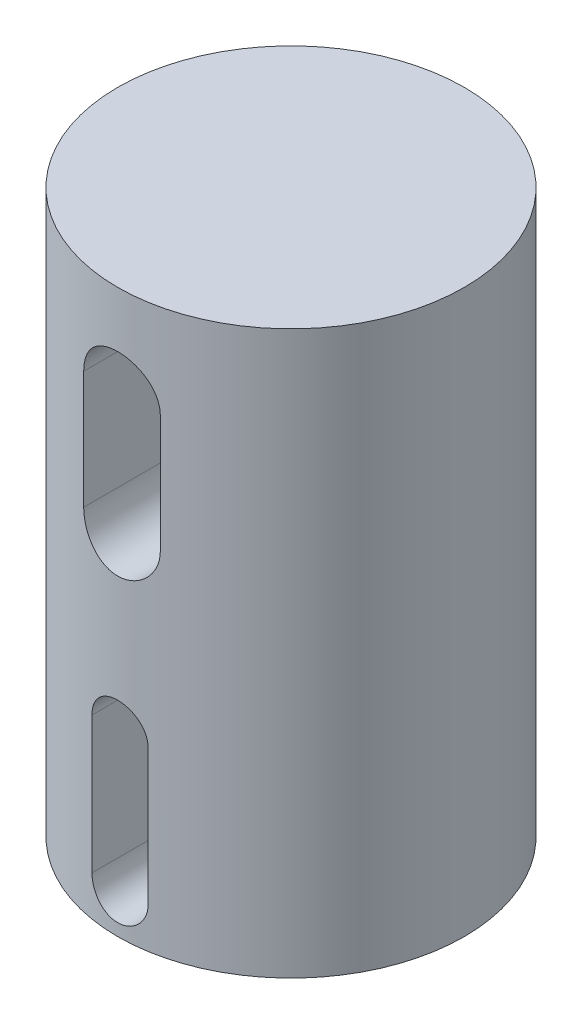
ISO-10303-21;
HEADER;
FILE_DESCRIPTION(('STEP AP214'),'2;1');
FILE_NAME('part.step','',(''),(''),'','','');
FILE_SCHEMA(('AUTOMOTIVE_DESIGN { 1 0 10303 214 1 1 1 1 }'));
ENDSEC;
DATA;
#1=APPLICATION_CONTEXT('core data for automotive mechanical design processes');
#2=APPLICATION_PROTOCOL_DEFINITION('international standard','automotive_design',2000,#1);
#3=PRODUCT_CONTEXT('',#1,'mechanical');
#4=PRODUCT('Part','Part','',(#3));
#5=PRODUCT_RELATED_PRODUCT_CATEGORY('part','',(#4));
#6=PRODUCT_DEFINITION_FORMATION('','',#4);
#7=PRODUCT_DEFINITION_CONTEXT('part definition',#1,'design');
#8=PRODUCT_DEFINITION('design','',#6,#7);
#9=PRODUCT_DEFINITION_SHAPE('','',#8);
#10=(LENGTH_UNIT() NAMED_UNIT(*) SI_UNIT(.MILLI.,.METRE.));
#11=(NAMED_UNIT(*) PLANE_ANGLE_UNIT() SI_UNIT($,.RADIAN.));
#12=(NAMED_UNIT(*) SI_UNIT($,.STERADIAN.) SOLID_ANGLE_UNIT());
#13=UNCERTAINTY_MEASURE_WITH_UNIT(LENGTH_MEASURE(1.E-05),#10,'distance_accuracy_value','');
#14=(GEOMETRIC_REPRESENTATION_CONTEXT(3) GLOBAL_UNCERTAINTY_ASSIGNED_CONTEXT((#13)) GLOBAL_UNIT_ASSIGNED_CONTEXT((#10,
#11,#12)) REPRESENTATION_CONTEXT('',''));
#15=CARTESIAN_POINT('',(0.,0.,0.));
#16=DIRECTION('',(0.,0.,1.));
#17=DIRECTION('',(1.,0.,0.));
#18=AXIS2_PLACEMENT_3D('',#15,#16,#17);
#19=CARTESIAN_POINT('',(0.,130.,0.));
#20=DIRECTION('',(0.,-1.,0.));
#21=DIRECTION('',(0.,0.,-1.));
#22=AXIS2_PLACEMENT_3D('',#19,#20,#21);
#23=CYLINDRICAL_SURFACE('',#22,40.0612109012705);
#24=DIRECTION('',(0.,-1.,0.));
#25=VECTOR('',#24,1.);
#26=CARTESIAN_POINT('',(8.85733849172649,130.,39.0697859441161));
#27=LINE('',#26,#25);
#28=CARTESIAN_POINT('',(8.85733849172649,108.295199343887,39.0697859441161));
#29=VERTEX_POINT('',#28);
#30=CARTESIAN_POINT('',(8.85733849172649,81.0621884588774,39.0697859441161));
#31=VERTEX_POINT('',#30);
#32=EDGE_CURVE('E11',#29,#31,#27,.T.);
#33=ORIENTED_EDGE('',*,*,#32,.T.);
#34=CARTESIAN_POINT('',(8.85733849172649,81.0621884588774,39.0697859441161));
#35=CARTESIAN_POINT('',(8.85736862514041,80.8163273564293,39.0697613117036));
#36=CARTESIAN_POINT('',(8.8471029394657,80.570474765995,39.0721058681542));
#37=CARTESIAN_POINT('',(8.80620076539065,80.0805899058059,39.0813543489662));
#38=CARTESIAN_POINT('',(8.77556715182994,79.8365573840715,39.0882576298836));
#39=CARTESIAN_POINT('',(8.69421905100763,79.3524574275804,39.1064291838135));
#40=CARTESIAN_POINT('',(8.64353879163294,79.1123839571394,39.1176900159823));
#41=CARTESIAN_POINT('',(8.52251401858338,78.6374745248508,39.144236272939));
#42=CARTESIAN_POINT('',(8.45216935052138,78.4026386041393,39.1595217293245));
#43=CARTESIAN_POINT('',(8.29237790071108,77.939877196313,39.1936697363761));
#44=CARTESIAN_POINT('',(8.20293455253129,77.7119504754593,39.2125316439981));
#45=CARTESIAN_POINT('',(8.00557698938492,77.2644243275569,39.2532993214893));
#46=CARTESIAN_POINT('',(7.89765595595808,77.0448280111871,39.2752062144264));
#47=CARTESIAN_POINT('',(7.66415547847754,76.615518808133,39.3214381184222));
#48=CARTESIAN_POINT('',(7.53857699329189,76.4058053855944,39.3457629981537));
#49=CARTESIAN_POINT('',(7.27063062813367,75.9976070607811,39.3961562389163));
#50=CARTESIAN_POINT('',(7.1282620859637,75.7991226018322,39.4222246686952));
#51=CARTESIAN_POINT('',(6.8253899404433,75.4117127380569,39.4757986010856));
#52=CARTESIAN_POINT('',(6.6646413277187,75.2229810384817,39.503320028846));
#53=CARTESIAN_POINT('',(6.32791991634466,74.8596712126249,39.558654572253));
#54=CARTESIAN_POINT('',(6.15194698484809,74.6850932098738,39.5864676904431));
#55=CARTESIAN_POINT('',(5.7859200594194,74.3512314821128,39.641619538426));
#56=CARTESIAN_POINT('',(5.59586368097199,74.1919503575985,39.6689581869131));
#57=CARTESIAN_POINT('',(5.20296270593714,73.8898082397179,39.7224004371487));
#58=CARTESIAN_POINT('',(5.00011844167541,73.7469468199161,39.7485040709613));
#59=CARTESIAN_POINT('',(4.58069376841164,73.4771675031501,39.7990321448431));
#60=CARTESIAN_POINT('',(4.3639869515153,73.3504419717588,39.8234349905894));
#61=CARTESIAN_POINT('',(3.9204568822295,73.1157814468343,39.8695412738507));
#62=CARTESIAN_POINT('',(3.6936375106396,73.0078393216289,39.8912457349891));
#63=CARTESIAN_POINT('',(3.23138641861698,72.8115130880777,39.9313483043602));
#64=CARTESIAN_POINT('',(2.99595423521563,72.7231300329055,39.9497462345402));
#65=CARTESIAN_POINT('',(2.51818423327674,72.5666379622019,39.9827049505392));
#66=CARTESIAN_POINT('',(2.2758465394607,72.4985285807586,39.9972658056115));
#67=CARTESIAN_POINT('',(1.78996244581745,72.3840678587402,40.0219299424861));
#68=CARTESIAN_POINT('',(1.54649727933049,72.3373861410857,40.0321007535435));
#69=CARTESIAN_POINT('',(1.05636901356677,72.2645803349115,40.0480313802494));
#70=CARTESIAN_POINT('',(0.809705944925126,72.2384560496044,40.0537912381221));
#71=CARTESIAN_POINT('',(0.315013192535823,72.2069846023485,40.060736048565));
#72=CARTESIAN_POINT('',(0.0669836186692188,72.2016357935686,40.0619213637502));
#73=CARTESIAN_POINT('',(-0.428628271217608,72.2117560083495,40.0596842657529));
#74=CARTESIAN_POINT('',(-0.676210591505028,72.2272248322297,40.0562618967667));
#75=CARTESIAN_POINT('',(-1.16476022921607,72.2783942976664,40.0450072598245));
#76=CARTESIAN_POINT('',(-1.40576727175716,72.3137339901392,40.037253683096));
#77=CARTESIAN_POINT('',(-1.88397712831053,72.4041107509349,40.0176028672444));
#78=CARTESIAN_POINT('',(-2.12117853512227,72.4591549375974,40.0057041307049));
#79=CARTESIAN_POINT('',(-2.589996422941,72.5884948011973,39.978089890599));
#80=CARTESIAN_POINT('',(-2.82161390191677,72.6627870097954,39.9623750746915));
#81=CARTESIAN_POINT('',(-3.27774084824535,72.8300640531267,39.9275513687475));
#82=CARTESIAN_POINT('',(-3.50225003541088,72.9230496236363,39.9084423451174));
#83=CARTESIAN_POINT('',(-3.94429569623805,73.1277856633075,39.8671894916423));
#84=CARTESIAN_POINT('',(-4.16176789465354,73.2396705471254,39.8450241483626));
#85=CARTESIAN_POINT('',(-4.58653338389336,73.4809079634874,39.798366664967));
#86=CARTESIAN_POINT('',(-4.79382662921221,73.6102605741121,39.7738745144506));
#87=CARTESIAN_POINT('',(-5.19690570679813,73.8855467615169,39.7232181556221));
#88=CARTESIAN_POINT('',(-5.39269041683415,74.0314819512565,39.6970537847645));
#89=CARTESIAN_POINT('',(-5.77146760611019,74.338937126415,39.6437557091327));
#90=CARTESIAN_POINT('',(-5.95446016158853,74.500457018939,39.6166220101369));
#91=CARTESIAN_POINT('',(-6.31023968793187,74.8416296014669,39.5615291922752));
#92=CARTESIAN_POINT('',(-6.48272533782995,75.0215958145242,39.5335648192083));
#93=CARTESIAN_POINT('',(-6.81190212408968,75.3954047411682,39.4781770686464));
#94=CARTESIAN_POINT('',(-6.96859847760323,75.5892428347169,39.450753514877));
#95=CARTESIAN_POINT('',(-7.26525016406895,75.9896453088489,39.397201616364));
#96=CARTESIAN_POINT('',(-7.40519763323719,76.1962155989171,39.3710738833675));
#97=CARTESIAN_POINT('',(-7.66726493923479,76.6206024213808,39.3208783576756));
#98=CARTESIAN_POINT('',(-7.78938534807829,76.8384185926277,39.2968104988957));
#99=CARTESIAN_POINT('',(-8.01531884974299,77.2846392659583,39.251351802762));
#100=CARTESIAN_POINT('',(-8.11906271017704,77.5130798804636,39.2299711736443));
#101=CARTESIAN_POINT('',(-8.30688156333853,77.9781880112174,39.1906309041491));
#102=CARTESIAN_POINT('',(-8.39095731382699,78.2148552101135,39.17267113198));
#103=CARTESIAN_POINT('',(-8.53867804366612,78.694425603372,39.1407371845776));
#104=CARTESIAN_POINT('',(-8.60234782025804,78.9373208386292,39.1267581742634));
#105=CARTESIAN_POINT('',(-8.70884436438421,79.4277468608429,39.1031919769596));
#106=CARTESIAN_POINT('',(-8.75168098316427,79.6752753992609,39.0936027143434));
#107=CARTESIAN_POINT('',(-8.80838219273812,80.1129413487383,39.0808605830131));
#108=CARTESIAN_POINT('',(-8.82674821907766,80.3024795605936,39.0767119347328));
#109=CARTESIAN_POINT('',(-8.85122033244665,80.6820690798181,39.0711728978441));
#110=CARTESIAN_POINT('',(-8.8573467474399,80.8721190106211,39.0697779358655));
#111=CARTESIAN_POINT('',(-8.85733849172649,81.0621884588774,39.0697859441161));
#112=B_SPLINE_CURVE_WITH_KNOTS('',3,(#34,#35,#36,#37,#38,#39,#40,#41,#42,#43,#44,#45,#46,#47,
#48,#49,#50,#51,#52,#53,#54,#55,#56,#57,#58,#59,#60,#61,#62,#63,#64,#65,#66,#67,#68,#69,#70,#71,
#72,#73,#74,#75,#76,#77,#78,#79,#80,#81,#82,#83,#84,#85,#86,#87,#88,#89,#90,#91,#92,#93,#94,#95,
#96,#97,#98,#99,#100,#101,#102,#103,#104,#105,#106,#107,#108,#109,#110,#111),.UNSPECIFIED.,.F.,
.F.,(4,2,2,2,2,2,2,2,2,2,2,2,2,2,2,2,2,2,2,2,2,2,2,2,2,2,2,2,2,2,2,2,2,2,2,2,2,2,4),(0.,
0.737345029552919,1.47458600832271,2.21057360911096,2.94656698836976,3.68242816167518,
4.41856146305015,5.15465480496202,5.89077718800321,6.63820875318835,7.38564684110572,
8.13321177068837,8.88075728089798,9.63651406356938,10.3919832718916,11.1474931491561,
11.9029893896768,12.6464098669833,13.3898232277618,14.1331776584243,14.8765249589618,
15.6067865752622,16.3373122686169,17.0677064185356,17.7981293226208,18.5339845096341,
19.2698429860225,20.0057730994984,20.7416988266247,21.4933373689583,22.2447267323057,
22.9964675085492,23.7481841584972,24.5026752528817,25.2571372739009,26.0106789691738,
26.7638639945813,27.3348797800297,27.9049464119767),.UNSPECIFIED.);
#113=CARTESIAN_POINT('',(-8.85733849172649,81.0621884588774,39.0697859441161));
#114=VERTEX_POINT('',#113);
#115=EDGE_CURVE('E242',#31,#114,#112,.T.);
#116=ORIENTED_EDGE('',*,*,#115,.T.);
#117=DIRECTION('',(0.,-1.,0.));
#118=VECTOR('',#117,1.);
#119=CARTESIAN_POINT('',(-8.85733849172649,130.,39.0697859441161));
#120=LINE('',#119,#118);
#121=CARTESIAN_POINT('',(-8.85733849172649,108.295199343887,39.0697859441161));
#122=VERTEX_POINT('',#121);
#123=EDGE_CURVE('E53',#114,#122,#120,.F.);
#124=ORIENTED_EDGE('',*,*,#123,.T.);
#125=CARTESIAN_POINT('',(-8.85733849172649,108.295199343887,39.0697859441161));
#126=CARTESIAN_POINT('',(-8.85736862514041,108.541060446335,39.0697613117036));
#127=CARTESIAN_POINT('',(-8.8471029394657,108.78691303677,39.0721058681542));
#128=CARTESIAN_POINT('',(-8.80620076539065,109.276797896959,39.0813543489662));
#129=CARTESIAN_POINT('',(-8.77556715182994,109.520830418693,39.0882576298836));
#130=CARTESIAN_POINT('',(-8.69421905100763,110.004930375184,39.1064291838135));
#131=CARTESIAN_POINT('',(-8.64353879163294,110.245003845625,39.1176900159823));
#132=CARTESIAN_POINT('',(-8.52251401858338,110.719913277914,39.144236272939));
#133=CARTESIAN_POINT('',(-8.45216935052138,110.954749198625,39.1595217293245));
#134=CARTESIAN_POINT('',(-8.29237790071108,111.417510606452,39.1936697363761));
#135=CARTESIAN_POINT('',(-8.20293455253129,111.645437327305,39.2125316439981));
#136=CARTESIAN_POINT('',(-8.00557698938491,112.092963475208,39.2532993214893));
#137=CARTESIAN_POINT('',(-7.89765595595808,112.312559791578,39.2752062144264));
#138=CARTESIAN_POINT('',(-7.66415547847755,112.741868994632,39.3214381184221));
#139=CARTESIAN_POINT('',(-7.53857699329191,112.95158241717,39.3457629981537));
#140=CARTESIAN_POINT('',(-7.27063062813369,113.359780741984,39.3961562389163));
#141=CARTESIAN_POINT('',(-7.12826208596371,113.558265200932,39.4222246686952));
#142=CARTESIAN_POINT('',(-6.8253899404433,113.945675064708,39.4757986010856));
#143=CARTESIAN_POINT('',(-6.6646413277187,114.134406764283,39.503320028846));
#144=CARTESIAN_POINT('',(-6.32791991634466,114.49771659014,39.558654572253));
#145=CARTESIAN_POINT('',(-6.15194698484809,114.672294592891,39.5864676904431));
#146=CARTESIAN_POINT('',(-5.7859200594194,115.006156320652,39.641619538426));
#147=CARTESIAN_POINT('',(-5.59586368097199,115.165437445166,39.6689581869131));
#148=CARTESIAN_POINT('',(-5.20296270593714,115.467579563047,39.7224004371487));
#149=CARTESIAN_POINT('',(-5.00011844167541,115.610440982849,39.7485040709613));
#150=CARTESIAN_POINT('',(-4.58069376841164,115.880220299615,39.7990321448431));
#151=CARTESIAN_POINT('',(-4.3639869515153,116.006945831006,39.8234349905894));
#152=CARTESIAN_POINT('',(-3.9204568822295,116.24160635593,39.8695412738507));
#153=CARTESIAN_POINT('',(-3.6936375106396,116.349548481136,39.8912457349891));
#154=CARTESIAN_POINT('',(-3.23138641861698,116.545874714687,39.9313483043602));
#155=CARTESIAN_POINT('',(-2.99595423521563,116.634257769859,39.9497462345402));
#156=CARTESIAN_POINT('',(-2.51818423327674,116.790749840563,39.9827049505392));
#157=CARTESIAN_POINT('',(-2.2758465394607,116.858859222006,39.9972658056115));
#158=CARTESIAN_POINT('',(-1.78996244581745,116.973319944025,40.0219299424861));
#159=CARTESIAN_POINT('',(-1.54649727933049,117.020001661679,40.0321007535435));
#160=CARTESIAN_POINT('',(-1.05636901356677,117.092807467853,40.0480313802494));
#161=CARTESIAN_POINT('',(-0.809705944925128,117.11893175316,40.0537912381221));
#162=CARTESIAN_POINT('',(-0.315013192535825,117.150403200416,40.060736048565));
#163=CARTESIAN_POINT('',(-0.0669836186692205,117.155752009196,40.0619213637502));
#164=CARTESIAN_POINT('',(0.428628271217606,117.145631794415,40.0596842657529));
#165=CARTESIAN_POINT('',(0.676210591505028,117.130162970535,40.0562618967667));
#166=CARTESIAN_POINT('',(1.16476022921607,117.078993505098,40.0450072598245));
#167=CARTESIAN_POINT('',(1.40576727175716,117.043653812626,40.037253683096));
#168=CARTESIAN_POINT('',(1.88397712831053,116.95327705183,40.0176028672444));
#169=CARTESIAN_POINT('',(2.12117853512227,116.898232865167,40.0057041307049));
#170=CARTESIAN_POINT('',(2.589996422941,116.768893001567,39.978089890599));
#171=CARTESIAN_POINT('',(2.82161390191677,116.694600792969,39.9623750746915));
#172=CARTESIAN_POINT('',(3.27774084824535,116.527323749638,39.9275513687475));
#173=CARTESIAN_POINT('',(3.50225003541088,116.434338179128,39.9084423451174));
#174=CARTESIAN_POINT('',(3.94429569623805,116.229602139457,39.8671894916423));
#175=CARTESIAN_POINT('',(4.16176789465354,116.117717255639,39.8450241483626));
#176=CARTESIAN_POINT('',(4.58653338389336,115.876479839277,39.798366664967));
#177=CARTESIAN_POINT('',(4.79382662921221,115.747127228653,39.7738745144506));
#178=CARTESIAN_POINT('',(5.19690570679813,115.471841041248,39.7232181556221));
#179=CARTESIAN_POINT('',(5.39269041683415,115.325905851508,39.6970537847645));
#180=CARTESIAN_POINT('',(5.77146760611019,115.01845067635,39.6437557091327));
#181=CARTESIAN_POINT('',(5.95446016158852,114.856930783826,39.6166220101369));
#182=CARTESIAN_POINT('',(6.31023968793187,114.515758201298,39.5615291922752));
#183=CARTESIAN_POINT('',(6.48272533782995,114.335791988241,39.5335648192083));
#184=CARTESIAN_POINT('',(6.81190212408968,113.961983061596,39.4781770686464));
#185=CARTESIAN_POINT('',(6.96859847760323,113.768144968048,39.450753514877));
#186=CARTESIAN_POINT('',(7.26525016406896,113.367742493916,39.397201616364));
#187=CARTESIAN_POINT('',(7.4051976332372,113.161172203848,39.3710738833675));
#188=CARTESIAN_POINT('',(7.66726493923479,112.736785381384,39.3208783576756));
#189=CARTESIAN_POINT('',(7.78938534807829,112.518969210137,39.2968104988957));
#190=CARTESIAN_POINT('',(8.01531884974299,112.072748536806,39.251351802762));
#191=CARTESIAN_POINT('',(8.11906271017705,111.844307922301,39.2299711736443));
#192=CARTESIAN_POINT('',(8.30688156333853,111.379199791547,39.1906309041491));
#193=CARTESIAN_POINT('',(8.39095731382699,111.142532592651,39.17267113198));
#194=CARTESIAN_POINT('',(8.53867804366612,110.662962199393,39.1407371845776));
#195=CARTESIAN_POINT('',(8.60234782025804,110.420066964135,39.1267581742634));
#196=CARTESIAN_POINT('',(8.70884436438421,109.929640941922,39.1031919769596));
#197=CARTESIAN_POINT('',(8.75168098316427,109.682112403504,39.0936027143434));
#198=CARTESIAN_POINT('',(8.80838219273812,109.244446454026,39.0808605830131));
#199=CARTESIAN_POINT('',(8.82674821907766,109.054908242171,39.0767119347328));
#200=CARTESIAN_POINT('',(8.85122033244665,108.675318722947,39.0711728978441));
#201=CARTESIAN_POINT('',(8.8573467474399,108.485268792144,39.0697779358656));
#202=CARTESIAN_POINT('',(8.85733849172649,108.295199343887,39.0697859441161));
#203=B_SPLINE_CURVE_WITH_KNOTS('',3,(#125,#126,#127,#128,#129,#130,#131,#132,#133,#134,#135,
#136,#137,#138,#139,#140,#141,#142,#143,#144,#145,#146,#147,#148,#149,#150,#151,#152,#153,#154,
#155,#156,#157,#158,#159,#160,#161,#162,#163,#164,#165,#166,#167,#168,#169,#170,#171,#172,#173,
#174,#175,#176,#177,#178,#179,#180,#181,#182,#183,#184,#185,#186,#187,#188,#189,#190,#191,#192,
#193,#194,#195,#196,#197,#198,#199,#200,#201,#202),.UNSPECIFIED.,.F.,.F.,(4,2,2,2,2,2,2,2,2,2,2,
2,2,2,2,2,2,2,2,2,2,2,2,2,2,2,2,2,2,2,2,2,2,2,2,2,2,2,4),(0.,0.737345029552919,1.47458600832271,
2.21057360911099,2.94656698836976,3.68242816167521,4.41856146305014,5.15465480496199,
5.89077718800321,6.63820875318835,7.38564684110572,8.13321177068837,8.88075728089798,
9.63651406356938,10.3919832718916,11.1474931491561,11.9029893896768,12.6464098669833,
13.3898232277618,14.1331776584243,14.8765249589618,15.6067865752622,16.3373122686169,
17.0677064185356,17.7981293226208,18.5339845096341,19.2698429860225,20.0057730994983,
20.7416988266247,21.4933373689583,22.2447267323057,22.9964675085493,23.7481841584972,
24.5026752528818,25.2571372739009,26.0106789691738,26.7638639945813,27.3348797800296,
27.9049464119767),.UNSPECIFIED.);
#204=EDGE_CURVE('E63',#122,#29,#203,.T.);
#205=ORIENTED_EDGE('',*,*,#204,.T.);
#206=EDGE_LOOP('',(#33,#116,#124,#205));
#207=FACE_BOUND('',#206,.T.);
#208=DIRECTION('',(0.,-1.,0.));
#209=VECTOR('',#208,1.);
#210=CARTESIAN_POINT('',(6.47775501633729,130.,39.534027227496));
#211=LINE('',#210,#209);
#212=CARTESIAN_POINT('',(6.47775501633729,40.8736675411931,39.534027227496));
#213=VERTEX_POINT('',#212);
#214=CARTESIAN_POINT('',(6.47775501633729,9.27808695130303,39.534027227496));
#215=VERTEX_POINT('',#214);
#216=EDGE_CURVE('E236',#213,#215,#211,.T.);
#217=ORIENTED_EDGE('',*,*,#216,.T.);
#218=CARTESIAN_POINT('',(6.47775501633729,9.27808695130303,39.534027227496));
#219=CARTESIAN_POINT('',(6.47777591810485,9.09716672052493,39.5340143578984));
#220=CARTESIAN_POINT('',(6.47017641112598,8.91625110029737,39.5352687127681));
#221=CARTESIAN_POINT('',(6.43988878030688,8.55573786690831,39.5402185908837));
#222=CARTESIAN_POINT('',(6.41720211963004,8.3761401276452,39.543913877406));
#223=CARTESIAN_POINT('',(6.35692965764029,8.01975658337227,39.5536463440131));
#224=CARTESIAN_POINT('',(6.31936233543086,7.84296757257438,39.5596806192966));
#225=CARTESIAN_POINT('',(6.22962071093268,7.49322733804501,39.5739121212082));
#226=CARTESIAN_POINT('',(6.17744643309169,7.32027610789073,39.5821093442162));
#227=CARTESIAN_POINT('',(6.0588773313233,6.97941791818191,39.6004320158345));
#228=CARTESIAN_POINT('',(5.99248195114376,6.81151115623254,39.6105575398676));
#229=CARTESIAN_POINT('',(5.84593246408443,6.48185129767808,39.6324511084664));
#230=CARTESIAN_POINT('',(5.76577327240344,6.32010050236351,39.6442197597556));
#231=CARTESIAN_POINT('',(5.59232250758312,6.00398703500354,39.6690586730608));
#232=CARTESIAN_POINT('',(5.49903594605215,5.84962157347106,39.6821284377989));
#233=CARTESIAN_POINT('',(5.2999274370963,5.54920435233571,39.7092115518657));
#234=CARTESIAN_POINT('',(5.19410083036827,5.40315571291001,39.723225251077));
#235=CARTESIAN_POINT('',(4.96979607304553,5.11931157746291,39.7519134776352));
#236=CARTESIAN_POINT('',(4.85122530362675,4.9815897011157,39.7665923219222));
#237=CARTESIAN_POINT('',(4.60289912646437,4.71654991211174,39.7960999827333));
#238=CARTESIAN_POINT('',(4.47313959438418,4.58923586990846,39.8109288527659));
#239=CARTESIAN_POINT('',(4.2033945225447,4.34597155700834,39.8403123881901));
#240=CARTESIAN_POINT('',(4.06341117350797,4.23001886423888,39.8548671114891));
#241=CARTESIAN_POINT('',(3.77410017683108,4.01021319845304,39.883303743745));
#242=CARTESIAN_POINT('',(3.62476910250556,3.90636470298798,39.8971854026219));
#243=CARTESIAN_POINT('',(3.31703110667348,3.7110409434622,39.9239514344327));
#244=CARTESIAN_POINT('',(3.15858076017822,3.61963330889995,39.9368302053264));
#245=CARTESIAN_POINT('',(2.83436972670126,3.45047143698619,39.9611486174667));
#246=CARTESIAN_POINT('',(2.66860633984219,3.37272229584577,39.9725877211));
#247=CARTESIAN_POINT('',(2.33107695133506,3.23153095765162,39.9936904375381));
#248=CARTESIAN_POINT('',(2.15931383764554,3.16808198392169,40.0033548909242));
#249=CARTESIAN_POINT('',(1.81087496336137,3.0559047203408,40.0206419874517));
#250=CARTESIAN_POINT('',(1.63419743825878,3.00718179433356,40.028263886495));
#251=CARTESIAN_POINT('',(1.2788553066239,2.92523012746984,40.0411847299382));
#252=CARTESIAN_POINT('',(1.10022225032907,2.89186771691257,40.0465036896934));
#253=CARTESIAN_POINT('',(0.740727794696676,2.84026067975258,40.0547658285618));
#254=CARTESIAN_POINT('',(0.559866368147656,2.82201623794709,40.0577089786338));
#255=CARTESIAN_POINT('',(0.197234419112963,2.80078847466383,40.0611357078898));
#256=CARTESIAN_POINT('',(0.0154639348286128,2.79780451720018,40.061619389573));
#257=CARTESIAN_POINT('',(-0.347674301099597,2.80711938861878,40.0601136906397));
#258=CARTESIAN_POINT('',(-0.529042054540867,2.81941814915549,40.0581243210828));
#259=CARTESIAN_POINT('',(-0.888372278784167,2.85901605744839,40.0517590573479));
#260=CARTESIAN_POINT('',(-1.06635073325915,2.88617397591458,40.0474056352535));
#261=CARTESIAN_POINT('',(-1.41936075107169,2.95518657283487,40.0364486296432));
#262=CARTESIAN_POINT('',(-1.59439236788836,2.99704098427552,40.0298450870086));
#263=CARTESIAN_POINT('',(-1.94031855163444,3.09514242877726,40.0145694229064));
#264=CARTESIAN_POINT('',(-2.11121228971735,3.15139231967213,40.0058968907199));
#265=CARTESIAN_POINT('',(-2.4475814840599,3.27784299404984,39.9867269869479));
#266=CARTESIAN_POINT('',(-2.61305883273074,3.34803884307845,39.976230260975));
#267=CARTESIAN_POINT('',(-2.93828998566105,3.50224905210783,39.9536452701266));
#268=CARTESIAN_POINT('',(-3.09801316094506,3.58632694027173,39.9415497419395));
#269=CARTESIAN_POINT('',(-3.40976173301538,3.76743177006562,39.9161445738537));
#270=CARTESIAN_POINT('',(-3.56178984649915,3.86445409712718,39.9028353671525));
#271=CARTESIAN_POINT('',(-3.85723696388021,4.07083088794954,39.8753603806279));
#272=CARTESIAN_POINT('',(-4.00065261262805,4.18019011063622,39.8611942712405));
#273=CARTESIAN_POINT('',(-4.27779311093552,4.410414234115,39.8324052955175));
#274=CARTESIAN_POINT('',(-4.4115213910409,4.53127502647904,39.8177825935242));
#275=CARTESIAN_POINT('',(-4.66994398056468,4.785189393624,39.7883067752332));
#276=CARTESIAN_POINT('',(-4.79451448348609,4.91836892757461,39.7734529629831));
#277=CARTESIAN_POINT('',(-5.0319623810809,5.19472540410469,39.7441100525854));
#278=CARTESIAN_POINT('',(-5.14484400411758,5.33789869991972,39.7296208239984));
#279=CARTESIAN_POINT('',(-5.35824462441635,5.63339751863898,39.701403371694));
#280=CARTESIAN_POINT('',(-5.458755360245,5.78572905756087,39.6876756598518));
#281=CARTESIAN_POINT('',(-5.64657258060733,6.09834386126005,39.6613896580924));
#282=CARTESIAN_POINT('',(-5.73388404250855,6.25862409819852,39.6488309280491));
#283=CARTESIAN_POINT('',(-5.89487141597025,6.58639520809823,39.6252160358467));
#284=CARTESIAN_POINT('',(-5.96852003234803,6.75389970835234,39.6141628929554));
#285=CARTESIAN_POINT('',(-6.10139214108805,7.09457195872283,39.5939155816044));
#286=CARTESIAN_POINT('',(-6.16062119326176,7.26773749678401,39.5847206968815));
#287=CARTESIAN_POINT('',(-6.26418431334936,7.61836169794743,39.5684642271871));
#288=CARTESIAN_POINT('',(-6.30853410101083,7.79581561652116,39.5614003915907));
#289=CARTESIAN_POINT('',(-6.38206526463456,8.15384184413446,39.5496049316161));
#290=CARTESIAN_POINT('',(-6.41125392836658,8.33441261173205,39.5448721867674));
#291=CARTESIAN_POINT('',(-6.44775145011868,8.64243360123479,39.5389346227547));
#292=CARTESIAN_POINT('',(-6.45900887301542,8.7694178571493,39.5370955450014));
#293=CARTESIAN_POINT('',(-6.47400598176656,9.02362631359549,39.534641521326));
#294=CARTESIAN_POINT('',(-6.47775831047953,9.15084974861972,39.5340245167528));
#295=CARTESIAN_POINT('',(-6.47775501633729,9.27808695130303,39.534027227496));
#296=B_SPLINE_CURVE_WITH_KNOTS('',3,(#218,#219,#220,#221,#222,#223,#224,#225,#226,#227,#228,
#229,#230,#231,#232,#233,#234,#235,#236,#237,#238,#239,#240,#241,#242,#243,#244,#245,#246,#247,
#248,#249,#250,#251,#252,#253,#254,#255,#256,#257,#258,#259,#260,#261,#262,#263,#264,#265,#266,
#267,#268,#269,#270,#271,#272,#273,#274,#275,#276,#277,#278,#279,#280,#281,#282,#283,#284,#285,
#286,#287,#288,#289,#290,#291,#292,#293,#294,#295),.UNSPECIFIED.,.F.,.F.,(4,2,2,2,2,2,2,2,2,2,2,
2,2,2,2,2,2,2,2,2,2,2,2,2,2,2,2,2,2,2,2,2,2,2,2,2,2,2,4),(0.,0.542589968306965,1.08512732350703,
1.62699304659896,2.16885786277168,2.71074387761914,3.25283051526781,3.7947107602753,
4.33679297808345,4.8831219356856,5.42965314591053,5.9760675890527,6.5226835230945,
7.07216138304561,7.62184382888246,8.17126523658057,8.72088652607216,9.26563005813993,
9.81038024888028,10.3551077367857,10.8998327886345,11.4394682206303,11.9790938487591,
12.5188266882014,13.0583688947077,13.6004523535437,14.1423430786197,14.6844435560762,
15.2263511137661,15.7745902102935,16.3226302875464,16.8710343895902,17.4192311730814,
17.9685116020352,18.5175799060247,19.0660662863123,19.6142887712376,19.9965609436247,
20.3781886074695),.UNSPECIFIED.);
#297=CARTESIAN_POINT('',(-6.47775501633729,9.27808695130303,39.534027227496));
#298=VERTEX_POINT('',#297);
#299=EDGE_CURVE('E188',#215,#298,#296,.T.);
#300=ORIENTED_EDGE('',*,*,#299,.T.);
#301=DIRECTION('',(0.,-1.,0.));
#302=VECTOR('',#301,1.);
#303=CARTESIAN_POINT('',(-6.4777550163373,130.,39.534027227496));
#304=LINE('',#303,#302);
#305=CARTESIAN_POINT('',(-6.4777550163373,40.8736675411931,39.534027227496));
#306=VERTEX_POINT('',#305);
#307=EDGE_CURVE('E245',#298,#306,#304,.F.);
#308=ORIENTED_EDGE('',*,*,#307,.T.);
#309=CARTESIAN_POINT('',(-6.4777550163373,40.8736675411931,39.534027227496));
#310=CARTESIAN_POINT('',(-6.47777591810485,41.0545877719712,39.5340143578984));
#311=CARTESIAN_POINT('',(-6.47017641112598,41.2355033921987,39.5352687127681));
#312=CARTESIAN_POINT('',(-6.43988878030688,41.5960166255878,39.5402185908837));
#313=CARTESIAN_POINT('',(-6.41720211963004,41.7756143648509,39.543913877406));
#314=CARTESIAN_POINT('',(-6.35692965764029,42.1319979091238,39.5536463440131));
#315=CARTESIAN_POINT('',(-6.31936233543086,42.3087869199217,39.5596806192966));
#316=CARTESIAN_POINT('',(-6.22962071093268,42.6585271544511,39.5739121212082));
#317=CARTESIAN_POINT('',(-6.17744643309169,42.8314783846054,39.5821093442162));
#318=CARTESIAN_POINT('',(-6.0588773313233,43.1723365743142,39.6004320158345));
#319=CARTESIAN_POINT('',(-5.99248195114376,43.3402433362636,39.6105575398676));
#320=CARTESIAN_POINT('',(-5.84593246408443,43.669903194818,39.6324511084664));
#321=CARTESIAN_POINT('',(-5.76577327240344,43.8316539901326,39.6442197597556));
#322=CARTESIAN_POINT('',(-5.59232250758312,44.1477674574926,39.6690586730608));
#323=CARTESIAN_POINT('',(-5.49903594605215,44.302132919025,39.6821284377989));
#324=CARTESIAN_POINT('',(-5.2999274370963,44.6025501401604,39.7092115518657));
#325=CARTESIAN_POINT('',(-5.19410083036827,44.7485987795861,39.723225251077));
#326=CARTESIAN_POINT('',(-4.96979607304553,45.0324429150332,39.7519134776352));
#327=CARTESIAN_POINT('',(-4.85122530362675,45.1701647913804,39.7665923219222));
#328=CARTESIAN_POINT('',(-4.60289912646437,45.4352045803844,39.7960999827333));
#329=CARTESIAN_POINT('',(-4.47313959438418,45.5625186225876,39.8109288527659));
#330=CARTESIAN_POINT('',(-4.2033945225447,45.8057829354878,39.8403123881901));
#331=CARTESIAN_POINT('',(-4.06341117350797,45.9217356282572,39.8548671114891));
#332=CARTESIAN_POINT('',(-3.77410017683108,46.1415412940431,39.883303743745));
#333=CARTESIAN_POINT('',(-3.62476910250556,46.2453897895081,39.8971854026219));
#334=CARTESIAN_POINT('',(-3.31703110667348,46.4407135490339,39.9239514344327));
#335=CARTESIAN_POINT('',(-3.15858076017822,46.5321211835961,39.9368302053264));
#336=CARTESIAN_POINT('',(-2.83436972670126,46.7012830555099,39.9611486174667));
#337=CARTESIAN_POINT('',(-2.66860633984219,46.7790321966503,39.9725877211));
#338=CARTESIAN_POINT('',(-2.33107695133506,46.9202235348445,39.9936904375381));
#339=CARTESIAN_POINT('',(-2.15931383764554,46.9836725085744,40.0033548909242));
#340=CARTESIAN_POINT('',(-1.81087496336137,47.0958497721553,40.0206419874517));
#341=CARTESIAN_POINT('',(-1.63419743825878,47.1445726981625,40.028263886495));
#342=CARTESIAN_POINT('',(-1.2788553066239,47.2265243650263,40.0411847299382));
#343=CARTESIAN_POINT('',(-1.10022225032907,47.2598867755835,40.0465036896934));
#344=CARTESIAN_POINT('',(-0.740727794696674,47.3114938127435,40.0547658285618));
#345=CARTESIAN_POINT('',(-0.559866368147654,47.329738254549,40.0577089786338));
#346=CARTESIAN_POINT('',(-0.197234419112961,47.3509660178323,40.0611357078898));
#347=CARTESIAN_POINT('',(-0.0154639348286118,47.3539499752959,40.061619389573));
#348=CARTESIAN_POINT('',(0.347674301099597,47.3446351038773,40.0601136906397));
#349=CARTESIAN_POINT('',(0.529042054540867,47.3323363433406,40.0581243210828));
#350=CARTESIAN_POINT('',(0.888372278784164,47.2927384350477,40.0517590573479));
#351=CARTESIAN_POINT('',(1.06635073325914,47.2655805165815,40.0474056352535));
#352=CARTESIAN_POINT('',(1.41936075107168,47.1965679196612,40.0364486296432));
#353=CARTESIAN_POINT('',(1.59439236788836,47.1547135082206,40.0298450870086));
#354=CARTESIAN_POINT('',(1.94031855163444,47.0566120637188,40.0145694229064));
#355=CARTESIAN_POINT('',(2.11121228971735,47.000362172824,40.0058968907199));
#356=CARTESIAN_POINT('',(2.44758148405989,46.8739114984463,39.9867269869479));
#357=CARTESIAN_POINT('',(2.61305883273073,46.8037156494176,39.976230260975));
#358=CARTESIAN_POINT('',(2.93828998566104,46.6495054403883,39.9536452701266));
#359=CARTESIAN_POINT('',(3.09801316094506,46.5654275522244,39.9415497419395));
#360=CARTESIAN_POINT('',(3.40976173301538,46.3843227224305,39.9161445738537));
#361=CARTESIAN_POINT('',(3.56178984649915,46.2873003953689,39.9028353671525));
#362=CARTESIAN_POINT('',(3.85723696388021,46.0809236045465,39.8753603806279));
#363=CARTESIAN_POINT('',(4.00065261262804,45.9715643818599,39.8611942712405));
#364=CARTESIAN_POINT('',(4.27779311093552,45.7413402583811,39.8324052955175));
#365=CARTESIAN_POINT('',(4.4115213910409,45.6204794660171,39.8177825935242));
#366=CARTESIAN_POINT('',(4.66994398056469,45.3665650988721,39.7883067752332));
#367=CARTESIAN_POINT('',(4.79451448348609,45.2333855649215,39.7734529629831));
#368=CARTESIAN_POINT('',(5.0319623810809,44.9570290883914,39.7441100525854));
#369=CARTESIAN_POINT('',(5.14484400411758,44.8138557925764,39.7296208239984));
#370=CARTESIAN_POINT('',(5.35824462441635,44.5183569738571,39.701403371694));
#371=CARTESIAN_POINT('',(5.458755360245,44.3660254349352,39.6876756598518));
#372=CARTESIAN_POINT('',(5.64657258060733,44.053410631236,39.6613896580924));
#373=CARTESIAN_POINT('',(5.73388404250855,43.8931303942976,39.6488309280491));
#374=CARTESIAN_POINT('',(5.89487141597025,43.5653592843979,39.6252160358467));
#375=CARTESIAN_POINT('',(5.96852003234803,43.3978547841437,39.6141628929554));
#376=CARTESIAN_POINT('',(6.10139214108805,43.0571825337733,39.5939155816044));
#377=CARTESIAN_POINT('',(6.16062119326176,42.8840169957121,39.5847206968815));
#378=CARTESIAN_POINT('',(6.26418431334936,42.5333927945487,39.5684642271871));
#379=CARTESIAN_POINT('',(6.30853410101083,42.3559388759749,39.5614003915907));
#380=CARTESIAN_POINT('',(6.38206526463456,41.9979126483616,39.5496049316161));
#381=CARTESIAN_POINT('',(6.41125392836658,41.817341880764,39.5448721867673));
#382=CARTESIAN_POINT('',(6.44775145011868,41.5093208912613,39.5389346227546));
#383=CARTESIAN_POINT('',(6.45900887301542,41.3823366353468,39.5370955450014));
#384=CARTESIAN_POINT('',(6.47400598176656,41.1281281789006,39.534641521326));
#385=CARTESIAN_POINT('',(6.47775831047953,41.0009047438764,39.5340245167528));
#386=CARTESIAN_POINT('',(6.47775501633729,40.8736675411931,39.534027227496));
#387=B_SPLINE_CURVE_WITH_KNOTS('',3,(#309,#310,#311,#312,#313,#314,#315,#316,#317,#318,#319,
#320,#321,#322,#323,#324,#325,#326,#327,#328,#329,#330,#331,#332,#333,#334,#335,#336,#337,#338,
#339,#340,#341,#342,#343,#344,#345,#346,#347,#348,#349,#350,#351,#352,#353,#354,#355,#356,#357,
#358,#359,#360,#361,#362,#363,#364,#365,#366,#367,#368,#369,#370,#371,#372,#373,#374,#375,#376,
#377,#378,#379,#380,#381,#382,#383,#384,#385,#386),.UNSPECIFIED.,.F.,.F.,(4,2,2,2,2,2,2,2,2,2,2,
2,2,2,2,2,2,2,2,2,2,2,2,2,2,2,2,2,2,2,2,2,2,2,2,2,2,2,4),(0.,0.542589968306965,1.08512732350702,
1.62699304659896,2.16885786277168,2.71074387761914,3.25283051526782,3.7947107602753,
4.33679297808345,4.8831219356856,5.42965314591053,5.9760675890527,6.5226835230945,
7.07216138304561,7.62184382888247,8.17126523658057,8.72088652607217,9.26563005813994,
9.81038024888028,10.3551077367857,10.8998327886345,11.4394682206303,11.9790938487591,
12.5188266882014,13.0583688947077,13.6004523535437,14.1423430786197,14.6844435560762,
15.2263511137661,15.7745902102935,16.3226302875464,16.8710343895902,17.4192311730814,
17.9685116020353,18.5175799060247,19.0660662863123,19.6142887712376,19.9965609436247,
20.3781886074695),.UNSPECIFIED.);
#388=EDGE_CURVE('E68',#306,#213,#387,.T.);
#389=ORIENTED_EDGE('',*,*,#388,.T.);
#390=EDGE_LOOP('',(#217,#300,#308,#389));
#391=FACE_BOUND('',#390,.T.);
#392=CARTESIAN_POINT('',(0.,130.,0.));
#393=DIRECTION('',(0.,1.,0.));
#394=DIRECTION('',(0.,0.,1.));
#395=AXIS2_PLACEMENT_3D('',#392,#393,#394);
#396=CIRCLE('',#395,40.0612109012705);
#397=CARTESIAN_POINT('',(0.,130.,40.0612109012705));
#398=VERTEX_POINT('',#397);
#399=EDGE_CURVE('E185',#398,#398,#396,.T.);
#400=ORIENTED_EDGE('',*,*,#399,.F.);
#401=EDGE_LOOP('',(#400));
#402=FACE_BOUND('',#401,.T.);
#403=CARTESIAN_POINT('',(0.,0.,0.));
#404=DIRECTION('',(0.,1.,0.));
#405=DIRECTION('',(0.,0.,1.));
#406=AXIS2_PLACEMENT_3D('',#403,#404,#405);
#407=CIRCLE('',#406,40.0612109012705);
#408=CARTESIAN_POINT('',(0.,0.,40.0612109012705));
#409=VERTEX_POINT('',#408);
#410=EDGE_CURVE('E147',#409,#409,#407,.T.);
#411=ORIENTED_EDGE('',*,*,#410,.T.);
#412=EDGE_LOOP('',(#411));
#413=FACE_BOUND('',#412,.T.);
#414=ADVANCED_FACE('F44',(#207,#391,#402,#413),#23,.T.);
#415=CARTESIAN_POINT('',(0.,130.,0.));
#416=DIRECTION('',(0.,1.,0.));
#417=DIRECTION('',(0.,0.,1.));
#418=AXIS2_PLACEMENT_3D('',#415,#416,#417);
#419=PLANE('',#418);
#420=ORIENTED_EDGE('',*,*,#399,.T.);
#421=EDGE_LOOP('',(#420));
#422=FACE_BOUND('',#421,.T.);
#423=ADVANCED_FACE('F219',(#422),#419,.T.);
#424=CARTESIAN_POINT('',(0.,0.,0.));
#425=DIRECTION('',(0.,1.,0.));
#426=DIRECTION('',(0.,0.,1.));
#427=AXIS2_PLACEMENT_3D('',#424,#425,#426);
#428=PLANE('',#427);
#429=ORIENTED_EDGE('',*,*,#410,.F.);
#430=EDGE_LOOP('',(#429));
#431=FACE_BOUND('',#430,.T.);
#432=ADVANCED_FACE('F225',(#431),#428,.F.);
#433=CARTESIAN_POINT('',(0.,40.8736675411931,20.0612109012704));
#434=DIRECTION('',(0.,0.,1.));
#435=DIRECTION('',(1.,0.,0.));
#436=AXIS2_PLACEMENT_3D('',#433,#434,#435);
#437=CYLINDRICAL_SURFACE('',#436,6.47775501633729);
#438=DIRECTION('',(0.,0.,1.));
#439=VECTOR('',#438,1.);
#440=CARTESIAN_POINT('',(-6.4777550163373,40.8736675411931,20.0612109012704));
#441=LINE('',#440,#439);
#442=CARTESIAN_POINT('',(-6.4777550163373,40.8736675411931,20.0612109012704));
#443=VERTEX_POINT('',#442);
#444=EDGE_CURVE('E160',#443,#306,#441,.T.);
#445=ORIENTED_EDGE('',*,*,#444,.F.);
#446=CARTESIAN_POINT('',(0.,40.8736675411931,20.0612109012704));
#447=DIRECTION('',(0.,0.,1.));
#448=DIRECTION('',(1.,0.,0.));
#449=AXIS2_PLACEMENT_3D('',#446,#447,#448);
#450=CIRCLE('',#449,6.47775501633729);
#451=CARTESIAN_POINT('',(6.47775501633729,40.8736675411931,20.0612109012704));
#452=VERTEX_POINT('',#451);
#453=EDGE_CURVE('E136',#452,#443,#450,.T.);
#454=ORIENTED_EDGE('',*,*,#453,.F.);
#455=DIRECTION('',(0.,0.,1.));
#456=VECTOR('',#455,1.);
#457=CARTESIAN_POINT('',(6.47775501633729,40.8736675411931,20.0612109012704));
#458=LINE('',#457,#456);
#459=EDGE_CURVE('E166',#452,#213,#458,.T.);
#460=ORIENTED_EDGE('',*,*,#459,.T.);
#461=ORIENTED_EDGE('',*,*,#388,.F.);
#462=EDGE_LOOP('',(#445,#454,#460,#461));
#463=FACE_BOUND('',#462,.T.);
#464=ADVANCED_FACE('F212',(#463),#437,.F.);
#465=CARTESIAN_POINT('',(6.47775501633729,40.8736675411931,20.0612109012704));
#466=DIRECTION('',(1.,0.,0.));
#467=DIRECTION('',(0.,1.,0.));
#468=AXIS2_PLACEMENT_3D('',#465,#466,#467);
#469=PLANE('',#468);
#470=ORIENTED_EDGE('',*,*,#459,.F.);
#471=DIRECTION('',(0.,1.,0.));
#472=VECTOR('',#471,1.);
#473=CARTESIAN_POINT('',(6.47775501633729,40.8736675411931,20.0612109012704));
#474=LINE('',#473,#472);
#475=CARTESIAN_POINT('',(6.47775501633729,9.27808695130303,20.0612109012704));
#476=VERTEX_POINT('',#475);
#477=EDGE_CURVE('E159',#476,#452,#474,.T.);
#478=ORIENTED_EDGE('',*,*,#477,.F.);
#479=DIRECTION('',(0.,0.,1.));
#480=VECTOR('',#479,1.);
#481=CARTESIAN_POINT('',(6.47775501633729,9.27808695130303,20.0612109012704));
#482=LINE('',#481,#480);
#483=EDGE_CURVE('E164',#476,#215,#482,.T.);
#484=ORIENTED_EDGE('',*,*,#483,.T.);
#485=ORIENTED_EDGE('',*,*,#216,.F.);
#486=EDGE_LOOP('',(#470,#478,#484,#485));
#487=FACE_BOUND('',#486,.T.);
#488=ADVANCED_FACE('F209',(#487),#469,.F.);
#489=CARTESIAN_POINT('',(0.,9.27808695130303,20.0612109012704));
#490=DIRECTION('',(0.,0.,1.));
#491=DIRECTION('',(1.,0.,0.));
#492=AXIS2_PLACEMENT_3D('',#489,#490,#491);
#493=CYLINDRICAL_SURFACE('',#492,6.47775501633729);
#494=ORIENTED_EDGE('',*,*,#483,.F.);
#495=CARTESIAN_POINT('',(0.,9.27808695130303,20.0612109012704));
#496=DIRECTION('',(0.,0.,1.));
#497=DIRECTION('',(1.,0.,0.));
#498=AXIS2_PLACEMENT_3D('',#495,#496,#497);
#499=CIRCLE('',#498,6.47775501633729);
#500=CARTESIAN_POINT('',(-6.47775501633729,9.27808695130303,20.0612109012704));
#501=VERTEX_POINT('',#500);
#502=EDGE_CURVE('E171',#501,#476,#499,.T.);
#503=ORIENTED_EDGE('',*,*,#502,.F.);
#504=DIRECTION('',(0.,0.,1.));
#505=VECTOR('',#504,1.);
#506=CARTESIAN_POINT('',(-6.47775501633729,9.27808695130303,20.0612109012704));
#507=LINE('',#506,#505);
#508=EDGE_CURVE('E161',#501,#298,#507,.T.);
#509=ORIENTED_EDGE('',*,*,#508,.T.);
#510=ORIENTED_EDGE('',*,*,#299,.F.);
#511=EDGE_LOOP('',(#494,#503,#509,#510));
#512=FACE_BOUND('',#511,.T.);
#513=ADVANCED_FACE('F204',(#512),#493,.F.);
#514=CARTESIAN_POINT('',(-6.4777550163373,40.8736675411931,20.0612109012704));
#515=DIRECTION('',(-1.,0.,0.));
#516=DIRECTION('',(0.,-1.,0.));
#517=AXIS2_PLACEMENT_3D('',#514,#515,#516);
#518=PLANE('',#517);
#519=ORIENTED_EDGE('',*,*,#508,.F.);
#520=DIRECTION('',(0.,-1.,0.));
#521=VECTOR('',#520,1.);
#522=CARTESIAN_POINT('',(-6.4777550163373,40.8736675411931,20.0612109012704));
#523=LINE('',#522,#521);
#524=EDGE_CURVE('E140',#443,#501,#523,.T.);
#525=ORIENTED_EDGE('',*,*,#524,.F.);
#526=ORIENTED_EDGE('',*,*,#444,.T.);
#527=ORIENTED_EDGE('',*,*,#307,.F.);
#528=EDGE_LOOP('',(#519,#525,#526,#527));
#529=FACE_BOUND('',#528,.T.);
#530=ADVANCED_FACE('F207',(#529),#518,.F.);
#531=CARTESIAN_POINT('',(0.,40.8736675411931,20.0612109012704));
#532=DIRECTION('',(0.,0.,1.));
#533=DIRECTION('',(1.,0.,0.));
#534=AXIS2_PLACEMENT_3D('',#531,#532,#533);
#535=PLANE('',#534);
#536=ORIENTED_EDGE('',*,*,#453,.T.);
#537=ORIENTED_EDGE('',*,*,#524,.T.);
#538=ORIENTED_EDGE('',*,*,#502,.T.);
#539=ORIENTED_EDGE('',*,*,#477,.T.);
#540=EDGE_LOOP('',(#536,#537,#538,#539));
#541=FACE_BOUND('',#540,.T.);
#542=ADVANCED_FACE('F216',(#541),#535,.T.);
#543=CARTESIAN_POINT('',(0.,108.295199343887,20.0612109012704));
#544=DIRECTION('',(0.,0.,1.));
#545=DIRECTION('',(1.,0.,0.));
#546=AXIS2_PLACEMENT_3D('',#543,#544,#545);
#547=CYLINDRICAL_SURFACE('',#546,8.85733849172649);
#548=DIRECTION('',(0.,0.,1.));
#549=VECTOR('',#548,1.);
#550=CARTESIAN_POINT('',(-8.85733849172649,108.295199343887,20.0612109012704));
#551=LINE('',#550,#549);
#552=CARTESIAN_POINT('',(-8.85733849172649,108.295199343887,20.0612109012704));
#553=VERTEX_POINT('',#552);
#554=EDGE_CURVE('E112',#553,#122,#551,.T.);
#555=ORIENTED_EDGE('',*,*,#554,.F.);
#556=CARTESIAN_POINT('',(0.,108.295199343887,20.0612109012704));
#557=DIRECTION('',(0.,0.,1.));
#558=DIRECTION('',(1.,0.,0.));
#559=AXIS2_PLACEMENT_3D('',#556,#557,#558);
#560=CIRCLE('',#559,8.85733849172649);
#561=CARTESIAN_POINT('',(8.85733849172649,108.295199343887,20.0612109012704));
#562=VERTEX_POINT('',#561);
#563=EDGE_CURVE('E113',#562,#553,#560,.T.);
#564=ORIENTED_EDGE('',*,*,#563,.F.);
#565=DIRECTION('',(0.,0.,1.));
#566=VECTOR('',#565,1.);
#567=CARTESIAN_POINT('',(8.85733849172649,108.295199343887,20.0612109012704));
#568=LINE('',#567,#566);
#569=EDGE_CURVE('E150',#562,#29,#568,.T.);
#570=ORIENTED_EDGE('',*,*,#569,.T.);
#571=ORIENTED_EDGE('',*,*,#204,.F.);
#572=EDGE_LOOP('',(#555,#564,#570,#571));
#573=FACE_BOUND('',#572,.T.);
#574=ADVANCED_FACE('F114',(#573),#547,.F.);
#575=CARTESIAN_POINT('',(8.85733849172649,108.295199343887,20.0612109012704));
#576=DIRECTION('',(1.,0.,0.));
#577=DIRECTION('',(0.,0.,-1.));
#578=AXIS2_PLACEMENT_3D('',#575,#576,#577);
#579=PLANE('',#578);
#580=ORIENTED_EDGE('',*,*,#569,.F.);
#581=DIRECTION('',(0.,1.,0.));
#582=VECTOR('',#581,1.);
#583=CARTESIAN_POINT('',(8.85733849172649,108.295199343887,20.0612109012704));
#584=LINE('',#583,#582);
#585=CARTESIAN_POINT('',(8.85733849172649,81.0621884588774,20.0612109012704));
#586=VERTEX_POINT('',#585);
#587=EDGE_CURVE('E121',#586,#562,#584,.T.);
#588=ORIENTED_EDGE('',*,*,#587,.F.);
#589=DIRECTION('',(0.,0.,1.));
#590=VECTOR('',#589,1.);
#591=CARTESIAN_POINT('',(8.85733849172649,81.0621884588774,20.0612109012704));
#592=LINE('',#591,#590);
#593=EDGE_CURVE('E151',#586,#31,#592,.T.);
#594=ORIENTED_EDGE('',*,*,#593,.T.);
#595=ORIENTED_EDGE('',*,*,#32,.F.);
#596=EDGE_LOOP('',(#580,#588,#594,#595));
#597=FACE_BOUND('',#596,.T.);
#598=ADVANCED_FACE('F264',(#597),#579,.F.);
#599=CARTESIAN_POINT('',(0.,81.0621884588774,20.0612109012704));
#600=DIRECTION('',(0.,0.,1.));
#601=DIRECTION('',(1.,0.,0.));
#602=AXIS2_PLACEMENT_3D('',#599,#600,#601);
#603=CYLINDRICAL_SURFACE('',#602,8.85733849172649);
#604=ORIENTED_EDGE('',*,*,#593,.F.);
#605=CARTESIAN_POINT('',(0.,81.0621884588774,20.0612109012704));
#606=DIRECTION('',(0.,0.,1.));
#607=DIRECTION('',(1.,0.,0.));
#608=AXIS2_PLACEMENT_3D('',#605,#606,#607);
#609=CIRCLE('',#608,8.85733849172649);
#610=CARTESIAN_POINT('',(-8.85733849172649,81.0621884588774,20.0612109012704));
#611=VERTEX_POINT('',#610);
#612=EDGE_CURVE('E133',#611,#586,#609,.T.);
#613=ORIENTED_EDGE('',*,*,#612,.F.);
#614=DIRECTION('',(0.,0.,1.));
#615=VECTOR('',#614,1.);
#616=CARTESIAN_POINT('',(-8.85733849172649,81.0621884588774,20.0612109012704));
#617=LINE('',#616,#615);
#618=EDGE_CURVE('E116',#611,#114,#617,.T.);
#619=ORIENTED_EDGE('',*,*,#618,.T.);
#620=ORIENTED_EDGE('',*,*,#115,.F.);
#621=EDGE_LOOP('',(#604,#613,#619,#620));
#622=FACE_BOUND('',#621,.T.);
#623=ADVANCED_FACE('F257',(#622),#603,.F.);
#624=CARTESIAN_POINT('',(-8.85733849172649,108.295199343887,20.0612109012704));
#625=DIRECTION('',(-1.,0.,0.));
#626=DIRECTION('',(0.,0.,1.));
#627=AXIS2_PLACEMENT_3D('',#624,#625,#626);
#628=PLANE('',#627);
#629=ORIENTED_EDGE('',*,*,#618,.F.);
#630=DIRECTION('',(0.,-1.,0.));
#631=VECTOR('',#630,1.);
#632=CARTESIAN_POINT('',(-8.85733849172649,108.295199343887,20.0612109012704));
#633=LINE('',#632,#631);
#634=EDGE_CURVE('E123',#553,#611,#633,.T.);
#635=ORIENTED_EDGE('',*,*,#634,.F.);
#636=ORIENTED_EDGE('',*,*,#554,.T.);
#637=ORIENTED_EDGE('',*,*,#123,.F.);
#638=EDGE_LOOP('',(#629,#635,#636,#637));
#639=FACE_BOUND('',#638,.T.);
#640=ADVANCED_FACE('F125',(#639),#628,.F.);
#641=CARTESIAN_POINT('',(0.,108.295199343887,20.0612109012704));
#642=DIRECTION('',(0.,0.,1.));
#643=DIRECTION('',(1.,0.,0.));
#644=AXIS2_PLACEMENT_3D('',#641,#642,#643);
#645=PLANE('',#644);
#646=ORIENTED_EDGE('',*,*,#563,.T.);
#647=ORIENTED_EDGE('',*,*,#634,.T.);
#648=ORIENTED_EDGE('',*,*,#612,.T.);
#649=ORIENTED_EDGE('',*,*,#587,.T.);
#650=EDGE_LOOP('',(#646,#647,#648,#649));
#651=FACE_BOUND('',#650,.T.);
#652=ADVANCED_FACE('F132',(#651),#645,.T.);
#653=CLOSED_SHELL('',(#414,#423,#432,#464,#488,#513,#530,#542,#574,#598,#623,#640,#652));
#654=MANIFOLD_SOLID_BREP('B2',#653);
#655=ADVANCED_BREP_SHAPE_REPRESENTATION('',(#18,#654),#14);
#656=SHAPE_DEFINITION_REPRESENTATION(#9,#655);
ENDSEC;
END-ISO-10303-21;
